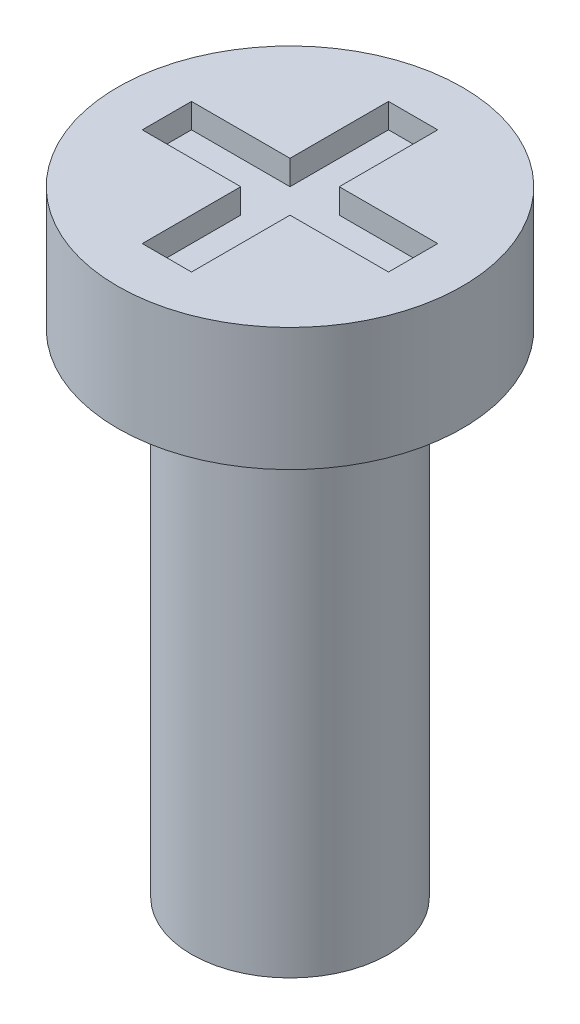
ISO-10303-21;
HEADER;
FILE_DESCRIPTION(('STEP AP214'),'2;1');
FILE_NAME('part.step','',(''),(''),'','','');
FILE_SCHEMA(('AUTOMOTIVE_DESIGN { 1 0 10303 214 1 1 1 1 }'));
ENDSEC;
DATA;
#1=APPLICATION_CONTEXT('core data for automotive mechanical design processes');
#2=APPLICATION_PROTOCOL_DEFINITION('international standard','automotive_design',2000,#1);
#3=PRODUCT_CONTEXT('',#1,'mechanical');
#4=PRODUCT('Part','Part','',(#3));
#5=PRODUCT_RELATED_PRODUCT_CATEGORY('part','',(#4));
#6=PRODUCT_DEFINITION_FORMATION('','',#4);
#7=PRODUCT_DEFINITION_CONTEXT('part definition',#1,'design');
#8=PRODUCT_DEFINITION('design','',#6,#7);
#9=PRODUCT_DEFINITION_SHAPE('','',#8);
#10=(LENGTH_UNIT() NAMED_UNIT(*) SI_UNIT(.MILLI.,.METRE.));
#11=(NAMED_UNIT(*) PLANE_ANGLE_UNIT() SI_UNIT($,.RADIAN.));
#12=(NAMED_UNIT(*) SI_UNIT($,.STERADIAN.) SOLID_ANGLE_UNIT());
#13=UNCERTAINTY_MEASURE_WITH_UNIT(LENGTH_MEASURE(1.E-05),#10,'distance_accuracy_value','');
#14=(GEOMETRIC_REPRESENTATION_CONTEXT(3) GLOBAL_UNCERTAINTY_ASSIGNED_CONTEXT((#13)) GLOBAL_UNIT_ASSIGNED_CONTEXT((#10,
#11,#12)) REPRESENTATION_CONTEXT('',''));
#15=CARTESIAN_POINT('',(0.,0.,0.));
#16=DIRECTION('',(0.,0.,1.));
#17=DIRECTION('',(1.,0.,0.));
#18=AXIS2_PLACEMENT_3D('',#15,#16,#17);
#19=CARTESIAN_POINT('',(0.,2.,0.));
#20=DIRECTION('',(0.,-1.,0.));
#21=DIRECTION('',(0.,0.,-1.));
#22=AXIS2_PLACEMENT_3D('',#19,#20,#21);
#23=CYLINDRICAL_SURFACE('',#22,0.399999999999999);
#24=CARTESIAN_POINT('',(0.,2.,0.));
#25=DIRECTION('',(0.,1.,0.));
#26=DIRECTION('',(0.,0.,1.));
#27=AXIS2_PLACEMENT_3D('',#24,#25,#26);
#28=CIRCLE('',#27,0.399999999999999);
#29=CARTESIAN_POINT('',(0.,2.,0.399999999999999));
#30=VERTEX_POINT('',#29);
#31=EDGE_CURVE('E11',#30,#30,#28,.T.);
#32=ORIENTED_EDGE('',*,*,#31,.F.);
#33=EDGE_LOOP('',(#32));
#34=FACE_BOUND('',#33,.T.);
#35=CARTESIAN_POINT('',(0.,0.,0.));
#36=DIRECTION('',(0.,1.,0.));
#37=DIRECTION('',(0.,0.,1.));
#38=AXIS2_PLACEMENT_3D('',#35,#36,#37);
#39=CIRCLE('',#38,0.399999999999999);
#40=CARTESIAN_POINT('',(0.,0.,0.399999999999999));
#41=VERTEX_POINT('',#40);
#42=EDGE_CURVE('E36',#41,#41,#39,.T.);
#43=ORIENTED_EDGE('',*,*,#42,.T.);
#44=EDGE_LOOP('',(#43));
#45=FACE_BOUND('',#44,.T.);
#46=ADVANCED_FACE('F33',(#34,#45),#23,.T.);
#47=CARTESIAN_POINT('',(0.,0.,0.));
#48=DIRECTION('',(0.,1.,0.));
#49=DIRECTION('',(0.,0.,1.));
#50=AXIS2_PLACEMENT_3D('',#47,#48,#49);
#51=PLANE('',#50);
#52=ORIENTED_EDGE('',*,*,#42,.F.);
#53=EDGE_LOOP('',(#52));
#54=FACE_BOUND('',#53,.T.);
#55=ADVANCED_FACE('F230',(#54),#51,.F.);
#56=CARTESIAN_POINT('',(0.,2.5,0.));
#57=DIRECTION('',(0.,-1.,0.));
#58=DIRECTION('',(0.,0.,-1.));
#59=AXIS2_PLACEMENT_3D('',#56,#57,#58);
#60=CYLINDRICAL_SURFACE('',#59,0.7);
#61=CARTESIAN_POINT('',(0.,2.5,0.));
#62=DIRECTION('',(0.,1.,0.));
#63=DIRECTION('',(0.,0.,1.));
#64=AXIS2_PLACEMENT_3D('',#61,#62,#63);
#65=CIRCLE('',#64,0.7);
#66=CARTESIAN_POINT('',(0.,2.5,0.7));
#67=VERTEX_POINT('',#66);
#68=EDGE_CURVE('E206',#67,#67,#65,.T.);
#69=ORIENTED_EDGE('',*,*,#68,.F.);
#70=EDGE_LOOP('',(#69));
#71=FACE_BOUND('',#70,.T.);
#72=CARTESIAN_POINT('',(0.,2.,0.));
#73=DIRECTION('',(0.,1.,0.));
#74=DIRECTION('',(0.,0.,1.));
#75=AXIS2_PLACEMENT_3D('',#72,#73,#74);
#76=CIRCLE('',#75,0.7);
#77=CARTESIAN_POINT('',(0.,2.,0.7));
#78=VERTEX_POINT('',#77);
#79=EDGE_CURVE('E188',#78,#78,#76,.T.);
#80=ORIENTED_EDGE('',*,*,#79,.T.);
#81=EDGE_LOOP('',(#80));
#82=FACE_BOUND('',#81,.T.);
#83=ADVANCED_FACE('F212',(#71,#82),#60,.T.);
#84=CARTESIAN_POINT('',(0.,2.5,0.));
#85=DIRECTION('',(0.,1.,0.));
#86=DIRECTION('',(0.,0.,1.));
#87=AXIS2_PLACEMENT_3D('',#84,#85,#86);
#88=PLANE('',#87);
#89=DIRECTION('',(0.,0.,1.));
#90=VECTOR('',#89,1.);
#91=CARTESIAN_POINT('',(-0.5,2.5,-0.1));
#92=LINE('',#91,#90);
#93=CARTESIAN_POINT('',(-0.5,2.5,-0.1));
#94=VERTEX_POINT('',#93);
#95=CARTESIAN_POINT('',(-0.5,2.5,0.1));
#96=VERTEX_POINT('',#95);
#97=EDGE_CURVE('E47',#94,#96,#92,.T.);
#98=ORIENTED_EDGE('',*,*,#97,.F.);
#99=DIRECTION('',(-1.,0.,0.));
#100=VECTOR('',#99,1.);
#101=CARTESIAN_POINT('',(-0.5,2.5,-0.1));
#102=LINE('',#101,#100);
#103=CARTESIAN_POINT('',(-0.1,2.5,-0.1));
#104=VERTEX_POINT('',#103);
#105=EDGE_CURVE('E184',#104,#94,#102,.T.);
#106=ORIENTED_EDGE('',*,*,#105,.F.);
#107=DIRECTION('',(0.,0.,1.));
#108=VECTOR('',#107,1.);
#109=CARTESIAN_POINT('',(-0.1,2.5,-0.5));
#110=LINE('',#109,#108);
#111=CARTESIAN_POINT('',(-0.1,2.5,-0.5));
#112=VERTEX_POINT('',#111);
#113=EDGE_CURVE('E182',#112,#104,#110,.T.);
#114=ORIENTED_EDGE('',*,*,#113,.F.);
#115=DIRECTION('',(-1.,0.,0.));
#116=VECTOR('',#115,1.);
#117=CARTESIAN_POINT('',(-0.1,2.5,-0.5));
#118=LINE('',#117,#116);
#119=CARTESIAN_POINT('',(0.0999999999999999,2.5,-0.5));
#120=VERTEX_POINT('',#119);
#121=EDGE_CURVE('E131',#120,#112,#118,.T.);
#122=ORIENTED_EDGE('',*,*,#121,.F.);
#123=DIRECTION('',(0.,0.,-1.));
#124=VECTOR('',#123,1.);
#125=CARTESIAN_POINT('',(0.0999999999999999,2.5,-0.5));
#126=LINE('',#125,#124);
#127=CARTESIAN_POINT('',(0.1,2.5,-0.1));
#128=VERTEX_POINT('',#127);
#129=EDGE_CURVE('E178',#128,#120,#126,.T.);
#130=ORIENTED_EDGE('',*,*,#129,.F.);
#131=DIRECTION('',(-1.,0.,0.));
#132=VECTOR('',#131,1.);
#133=CARTESIAN_POINT('',(0.1,2.5,-0.1));
#134=LINE('',#133,#132);
#135=CARTESIAN_POINT('',(0.5,2.5,-0.1));
#136=VERTEX_POINT('',#135);
#137=EDGE_CURVE('E175',#136,#128,#134,.T.);
#138=ORIENTED_EDGE('',*,*,#137,.F.);
#139=DIRECTION('',(0.,0.,-1.));
#140=VECTOR('',#139,1.);
#141=CARTESIAN_POINT('',(0.5,2.5,-0.1));
#142=LINE('',#141,#140);
#143=CARTESIAN_POINT('',(0.5,2.5,0.1));
#144=VERTEX_POINT('',#143);
#145=EDGE_CURVE('E172',#144,#136,#142,.T.);
#146=ORIENTED_EDGE('',*,*,#145,.F.);
#147=DIRECTION('',(1.,0.,0.));
#148=VECTOR('',#147,1.);
#149=CARTESIAN_POINT('',(0.1,2.5,0.1));
#150=LINE('',#149,#148);
#151=CARTESIAN_POINT('',(0.1,2.5,0.1));
#152=VERTEX_POINT('',#151);
#153=EDGE_CURVE('E169',#152,#144,#150,.T.);
#154=ORIENTED_EDGE('',*,*,#153,.F.);
#155=DIRECTION('',(0.,0.,-1.));
#156=VECTOR('',#155,1.);
#157=CARTESIAN_POINT('',(0.1,2.5,0.1));
#158=LINE('',#157,#156);
#159=CARTESIAN_POINT('',(0.1,2.5,0.5));
#160=VERTEX_POINT('',#159);
#161=EDGE_CURVE('E166',#160,#152,#158,.T.);
#162=ORIENTED_EDGE('',*,*,#161,.F.);
#163=DIRECTION('',(1.,0.,0.));
#164=VECTOR('',#163,1.);
#165=CARTESIAN_POINT('',(-0.1,2.5,0.5));
#166=LINE('',#165,#164);
#167=CARTESIAN_POINT('',(-0.1,2.5,0.5));
#168=VERTEX_POINT('',#167);
#169=EDGE_CURVE('E163',#168,#160,#166,.T.);
#170=ORIENTED_EDGE('',*,*,#169,.F.);
#171=DIRECTION('',(0.,0.,1.));
#172=VECTOR('',#171,1.);
#173=CARTESIAN_POINT('',(-0.1,2.5,0.1));
#174=LINE('',#173,#172);
#175=CARTESIAN_POINT('',(-0.1,2.5,0.1));
#176=VERTEX_POINT('',#175);
#177=EDGE_CURVE('E160',#176,#168,#174,.T.);
#178=ORIENTED_EDGE('',*,*,#177,.F.);
#179=DIRECTION('',(1.,0.,0.));
#180=VECTOR('',#179,1.);
#181=CARTESIAN_POINT('',(-0.5,2.5,0.1));
#182=LINE('',#181,#180);
#183=EDGE_CURVE('E157',#96,#176,#182,.T.);
#184=ORIENTED_EDGE('',*,*,#183,.F.);
#185=EDGE_LOOP('',(#98,#106,#114,#122,#130,#138,#146,#154,#162,#170,#178,#184));
#186=FACE_BOUND('',#185,.T.);
#187=ORIENTED_EDGE('',*,*,#68,.T.);
#188=EDGE_LOOP('',(#187));
#189=FACE_BOUND('',#188,.T.);
#190=ADVANCED_FACE('F217',(#186,#189),#88,.T.);
#191=CARTESIAN_POINT('',(0.,2.,0.));
#192=DIRECTION('',(0.,1.,0.));
#193=DIRECTION('',(0.,0.,1.));
#194=AXIS2_PLACEMENT_3D('',#191,#192,#193);
#195=PLANE('',#194);
#196=ORIENTED_EDGE('',*,*,#31,.T.);
#197=EDGE_LOOP('',(#196));
#198=FACE_BOUND('',#197,.T.);
#199=ORIENTED_EDGE('',*,*,#79,.F.);
#200=EDGE_LOOP('',(#199));
#201=FACE_BOUND('',#200,.T.);
#202=ADVANCED_FACE('F214',(#198,#201),#195,.F.);
#203=CARTESIAN_POINT('',(-0.5,2.4,-0.1));
#204=DIRECTION('',(-1.,0.,0.));
#205=DIRECTION('',(0.,0.,1.));
#206=AXIS2_PLACEMENT_3D('',#203,#204,#205);
#207=PLANE('',#206);
#208=ORIENTED_EDGE('',*,*,#97,.T.);
#209=DIRECTION('',(0.,1.,0.));
#210=VECTOR('',#209,1.);
#211=CARTESIAN_POINT('',(-0.5,2.4,0.1));
#212=LINE('',#211,#210);
#213=CARTESIAN_POINT('',(-0.5,2.4,0.1));
#214=VERTEX_POINT('',#213);
#215=EDGE_CURVE('E95',#214,#96,#212,.T.);
#216=ORIENTED_EDGE('',*,*,#215,.F.);
#217=DIRECTION('',(0.,0.,1.));
#218=VECTOR('',#217,1.);
#219=CARTESIAN_POINT('',(-0.5,2.4,-0.1));
#220=LINE('',#219,#218);
#221=CARTESIAN_POINT('',(-0.5,2.4,-0.1));
#222=VERTEX_POINT('',#221);
#223=EDGE_CURVE('E186',#222,#214,#220,.T.);
#224=ORIENTED_EDGE('',*,*,#223,.F.);
#225=DIRECTION('',(0.,1.,0.));
#226=VECTOR('',#225,1.);
#227=CARTESIAN_POINT('',(-0.5,2.4,-0.1));
#228=LINE('',#227,#226);
#229=EDGE_CURVE('E55',#222,#94,#228,.T.);
#230=ORIENTED_EDGE('',*,*,#229,.T.);
#231=EDGE_LOOP('',(#208,#216,#224,#230));
#232=FACE_BOUND('',#231,.T.);
#233=ADVANCED_FACE('F216',(#232),#207,.F.);
#234=CARTESIAN_POINT('',(-0.5,2.4,-0.1));
#235=DIRECTION('',(0.,0.,-1.));
#236=DIRECTION('',(-1.,0.,0.));
#237=AXIS2_PLACEMENT_3D('',#234,#235,#236);
#238=PLANE('',#237);
#239=ORIENTED_EDGE('',*,*,#105,.T.);
#240=ORIENTED_EDGE('',*,*,#229,.F.);
#241=DIRECTION('',(-1.,0.,0.));
#242=VECTOR('',#241,1.);
#243=CARTESIAN_POINT('',(-0.5,2.4,-0.1));
#244=LINE('',#243,#242);
#245=CARTESIAN_POINT('',(-0.1,2.4,-0.1));
#246=VERTEX_POINT('',#245);
#247=EDGE_CURVE('E143',#246,#222,#244,.T.);
#248=ORIENTED_EDGE('',*,*,#247,.F.);
#249=DIRECTION('',(0.,1.,0.));
#250=VECTOR('',#249,1.);
#251=CARTESIAN_POINT('',(-0.1,2.4,-0.1));
#252=LINE('',#251,#250);
#253=EDGE_CURVE('E135',#246,#104,#252,.T.);
#254=ORIENTED_EDGE('',*,*,#253,.T.);
#255=EDGE_LOOP('',(#239,#240,#248,#254));
#256=FACE_BOUND('',#255,.T.);
#257=ADVANCED_FACE('F224',(#256),#238,.F.);
#258=CARTESIAN_POINT('',(-0.1,2.4,-0.5));
#259=DIRECTION('',(-1.,0.,0.));
#260=DIRECTION('',(0.,0.,1.));
#261=AXIS2_PLACEMENT_3D('',#258,#259,#260);
#262=PLANE('',#261);
#263=ORIENTED_EDGE('',*,*,#113,.T.);
#264=ORIENTED_EDGE('',*,*,#253,.F.);
#265=DIRECTION('',(0.,0.,1.));
#266=VECTOR('',#265,1.);
#267=CARTESIAN_POINT('',(-0.1,2.4,-0.5));
#268=LINE('',#267,#266);
#269=CARTESIAN_POINT('',(-0.1,2.4,-0.5));
#270=VERTEX_POINT('',#269);
#271=EDGE_CURVE('E139',#270,#246,#268,.T.);
#272=ORIENTED_EDGE('',*,*,#271,.F.);
#273=DIRECTION('',(0.,1.,0.));
#274=VECTOR('',#273,1.);
#275=CARTESIAN_POINT('',(-0.1,2.4,-0.5));
#276=LINE('',#275,#274);
#277=EDGE_CURVE('E124',#270,#112,#276,.T.);
#278=ORIENTED_EDGE('',*,*,#277,.T.);
#279=EDGE_LOOP('',(#263,#264,#272,#278));
#280=FACE_BOUND('',#279,.T.);
#281=ADVANCED_FACE('F140',(#280),#262,.F.);
#282=CARTESIAN_POINT('',(-0.1,2.4,-0.5));
#283=DIRECTION('',(0.,0.,-1.));
#284=DIRECTION('',(-1.,0.,0.));
#285=AXIS2_PLACEMENT_3D('',#282,#283,#284);
#286=PLANE('',#285);
#287=ORIENTED_EDGE('',*,*,#121,.T.);
#288=ORIENTED_EDGE('',*,*,#277,.F.);
#289=DIRECTION('',(-1.,0.,0.));
#290=VECTOR('',#289,1.);
#291=CARTESIAN_POINT('',(-0.1,2.4,-0.5));
#292=LINE('',#291,#290);
#293=CARTESIAN_POINT('',(0.0999999999999999,2.4,-0.5));
#294=VERTEX_POINT('',#293);
#295=EDGE_CURVE('E128',#294,#270,#292,.T.);
#296=ORIENTED_EDGE('',*,*,#295,.F.);
#297=DIRECTION('',(0.,1.,0.));
#298=VECTOR('',#297,1.);
#299=CARTESIAN_POINT('',(0.0999999999999999,2.4,-0.5));
#300=LINE('',#299,#298);
#301=EDGE_CURVE('E136',#294,#120,#300,.T.);
#302=ORIENTED_EDGE('',*,*,#301,.T.);
#303=EDGE_LOOP('',(#287,#288,#296,#302));
#304=FACE_BOUND('',#303,.T.);
#305=ADVANCED_FACE('F126',(#304),#286,.F.);
#306=CARTESIAN_POINT('',(0.0999999999999999,2.4,-0.5));
#307=DIRECTION('',(1.,0.,0.));
#308=DIRECTION('',(0.,0.,-1.));
#309=AXIS2_PLACEMENT_3D('',#306,#307,#308);
#310=PLANE('',#309);
#311=ORIENTED_EDGE('',*,*,#129,.T.);
#312=ORIENTED_EDGE('',*,*,#301,.F.);
#313=DIRECTION('',(0.,0.,-1.));
#314=VECTOR('',#313,1.);
#315=CARTESIAN_POINT('',(0.0999999999999999,2.4,-0.5));
#316=LINE('',#315,#314);
#317=CARTESIAN_POINT('',(0.1,2.4,-0.1));
#318=VERTEX_POINT('',#317);
#319=EDGE_CURVE('E149',#318,#294,#316,.T.);
#320=ORIENTED_EDGE('',*,*,#319,.F.);
#321=DIRECTION('',(0.,1.,0.));
#322=VECTOR('',#321,1.);
#323=CARTESIAN_POINT('',(0.1,2.4,-0.1));
#324=LINE('',#323,#322);
#325=EDGE_CURVE('E191',#318,#128,#324,.T.);
#326=ORIENTED_EDGE('',*,*,#325,.T.);
#327=EDGE_LOOP('',(#311,#312,#320,#326));
#328=FACE_BOUND('',#327,.T.);
#329=ADVANCED_FACE('F285',(#328),#310,.F.);
#330=CARTESIAN_POINT('',(0.1,2.4,-0.1));
#331=DIRECTION('',(0.,0.,-1.));
#332=DIRECTION('',(-1.,0.,0.));
#333=AXIS2_PLACEMENT_3D('',#330,#331,#332);
#334=PLANE('',#333);
#335=ORIENTED_EDGE('',*,*,#137,.T.);
#336=ORIENTED_EDGE('',*,*,#325,.F.);
#337=DIRECTION('',(-1.,0.,0.));
#338=VECTOR('',#337,1.);
#339=CARTESIAN_POINT('',(0.1,2.4,-0.1));
#340=LINE('',#339,#338);
#341=CARTESIAN_POINT('',(0.5,2.4,-0.1));
#342=VERTEX_POINT('',#341);
#343=EDGE_CURVE('E151',#342,#318,#340,.T.);
#344=ORIENTED_EDGE('',*,*,#343,.F.);
#345=DIRECTION('',(0.,1.,0.));
#346=VECTOR('',#345,1.);
#347=CARTESIAN_POINT('',(0.5,2.4,-0.1));
#348=LINE('',#347,#346);
#349=EDGE_CURVE('E193',#342,#136,#348,.T.);
#350=ORIENTED_EDGE('',*,*,#349,.T.);
#351=EDGE_LOOP('',(#335,#336,#344,#350));
#352=FACE_BOUND('',#351,.T.);
#353=ADVANCED_FACE('F294',(#352),#334,.F.);
#354=CARTESIAN_POINT('',(0.5,2.4,-0.1));
#355=DIRECTION('',(1.,0.,0.));
#356=DIRECTION('',(0.,0.,-1.));
#357=AXIS2_PLACEMENT_3D('',#354,#355,#356);
#358=PLANE('',#357);
#359=ORIENTED_EDGE('',*,*,#145,.T.);
#360=ORIENTED_EDGE('',*,*,#349,.F.);
#361=DIRECTION('',(0.,0.,-1.));
#362=VECTOR('',#361,1.);
#363=CARTESIAN_POINT('',(0.5,2.4,-0.1));
#364=LINE('',#363,#362);
#365=CARTESIAN_POINT('',(0.5,2.4,0.1));
#366=VERTEX_POINT('',#365);
#367=EDGE_CURVE('E399',#366,#342,#364,.T.);
#368=ORIENTED_EDGE('',*,*,#367,.F.);
#369=DIRECTION('',(0.,1.,0.));
#370=VECTOR('',#369,1.);
#371=CARTESIAN_POINT('',(0.5,2.4,0.1));
#372=LINE('',#371,#370);
#373=EDGE_CURVE('E195',#366,#144,#372,.T.);
#374=ORIENTED_EDGE('',*,*,#373,.T.);
#375=EDGE_LOOP('',(#359,#360,#368,#374));
#376=FACE_BOUND('',#375,.T.);
#377=ADVANCED_FACE('F304',(#376),#358,.F.);
#378=CARTESIAN_POINT('',(0.1,2.4,0.1));
#379=DIRECTION('',(0.,0.,1.));
#380=DIRECTION('',(1.,0.,0.));
#381=AXIS2_PLACEMENT_3D('',#378,#379,#380);
#382=PLANE('',#381);
#383=ORIENTED_EDGE('',*,*,#153,.T.);
#384=ORIENTED_EDGE('',*,*,#373,.F.);
#385=DIRECTION('',(1.,0.,0.));
#386=VECTOR('',#385,1.);
#387=CARTESIAN_POINT('',(0.1,2.4,0.1));
#388=LINE('',#387,#386);
#389=CARTESIAN_POINT('',(0.1,2.4,0.1));
#390=VERTEX_POINT('',#389);
#391=EDGE_CURVE('E396',#390,#366,#388,.T.);
#392=ORIENTED_EDGE('',*,*,#391,.F.);
#393=DIRECTION('',(0.,1.,0.));
#394=VECTOR('',#393,1.);
#395=CARTESIAN_POINT('',(0.1,2.4,0.1));
#396=LINE('',#395,#394);
#397=EDGE_CURVE('E197',#390,#152,#396,.T.);
#398=ORIENTED_EDGE('',*,*,#397,.T.);
#399=EDGE_LOOP('',(#383,#384,#392,#398));
#400=FACE_BOUND('',#399,.T.);
#401=ADVANCED_FACE('F314',(#400),#382,.F.);
#402=CARTESIAN_POINT('',(0.1,2.4,0.1));
#403=DIRECTION('',(1.,0.,0.));
#404=DIRECTION('',(0.,0.,-1.));
#405=AXIS2_PLACEMENT_3D('',#402,#403,#404);
#406=PLANE('',#405);
#407=ORIENTED_EDGE('',*,*,#161,.T.);
#408=ORIENTED_EDGE('',*,*,#397,.F.);
#409=DIRECTION('',(0.,0.,-1.));
#410=VECTOR('',#409,1.);
#411=CARTESIAN_POINT('',(0.1,2.4,0.1));
#412=LINE('',#411,#410);
#413=CARTESIAN_POINT('',(0.1,2.4,0.5));
#414=VERTEX_POINT('',#413);
#415=EDGE_CURVE('E393',#414,#390,#412,.T.);
#416=ORIENTED_EDGE('',*,*,#415,.F.);
#417=DIRECTION('',(0.,1.,0.));
#418=VECTOR('',#417,1.);
#419=CARTESIAN_POINT('',(0.1,2.4,0.5));
#420=LINE('',#419,#418);
#421=EDGE_CURVE('E199',#414,#160,#420,.T.);
#422=ORIENTED_EDGE('',*,*,#421,.T.);
#423=EDGE_LOOP('',(#407,#408,#416,#422));
#424=FACE_BOUND('',#423,.T.);
#425=ADVANCED_FACE('F324',(#424),#406,.F.);
#426=CARTESIAN_POINT('',(-0.1,2.4,0.5));
#427=DIRECTION('',(0.,0.,1.));
#428=DIRECTION('',(1.,0.,0.));
#429=AXIS2_PLACEMENT_3D('',#426,#427,#428);
#430=PLANE('',#429);
#431=ORIENTED_EDGE('',*,*,#169,.T.);
#432=ORIENTED_EDGE('',*,*,#421,.F.);
#433=DIRECTION('',(1.,0.,0.));
#434=VECTOR('',#433,1.);
#435=CARTESIAN_POINT('',(-0.1,2.4,0.5));
#436=LINE('',#435,#434);
#437=CARTESIAN_POINT('',(-0.1,2.4,0.5));
#438=VERTEX_POINT('',#437);
#439=EDGE_CURVE('E386',#438,#414,#436,.T.);
#440=ORIENTED_EDGE('',*,*,#439,.F.);
#441=DIRECTION('',(0.,1.,0.));
#442=VECTOR('',#441,1.);
#443=CARTESIAN_POINT('',(-0.1,2.4,0.5));
#444=LINE('',#443,#442);
#445=EDGE_CURVE('E201',#438,#168,#444,.T.);
#446=ORIENTED_EDGE('',*,*,#445,.T.);
#447=EDGE_LOOP('',(#431,#432,#440,#446));
#448=FACE_BOUND('',#447,.T.);
#449=ADVANCED_FACE('F334',(#448),#430,.F.);
#450=CARTESIAN_POINT('',(-0.1,2.4,0.1));
#451=DIRECTION('',(-1.,0.,0.));
#452=DIRECTION('',(0.,0.,1.));
#453=AXIS2_PLACEMENT_3D('',#450,#451,#452);
#454=PLANE('',#453);
#455=ORIENTED_EDGE('',*,*,#177,.T.);
#456=ORIENTED_EDGE('',*,*,#445,.F.);
#457=DIRECTION('',(0.,0.,1.));
#458=VECTOR('',#457,1.);
#459=CARTESIAN_POINT('',(-0.1,2.4,0.1));
#460=LINE('',#459,#458);
#461=CARTESIAN_POINT('',(-0.1,2.4,0.1));
#462=VERTEX_POINT('',#461);
#463=EDGE_CURVE('E383',#462,#438,#460,.T.);
#464=ORIENTED_EDGE('',*,*,#463,.F.);
#465=DIRECTION('',(0.,1.,0.));
#466=VECTOR('',#465,1.);
#467=CARTESIAN_POINT('',(-0.1,2.4,0.1));
#468=LINE('',#467,#466);
#469=EDGE_CURVE('E203',#462,#176,#468,.T.);
#470=ORIENTED_EDGE('',*,*,#469,.T.);
#471=EDGE_LOOP('',(#455,#456,#464,#470));
#472=FACE_BOUND('',#471,.T.);
#473=ADVANCED_FACE('F344',(#472),#454,.F.);
#474=CARTESIAN_POINT('',(-0.5,2.4,0.1));
#475=DIRECTION('',(0.,0.,1.));
#476=DIRECTION('',(1.,0.,0.));
#477=AXIS2_PLACEMENT_3D('',#474,#475,#476);
#478=PLANE('',#477);
#479=ORIENTED_EDGE('',*,*,#183,.T.);
#480=ORIENTED_EDGE('',*,*,#469,.F.);
#481=DIRECTION('',(1.,0.,0.));
#482=VECTOR('',#481,1.);
#483=CARTESIAN_POINT('',(-0.5,2.4,0.1));
#484=LINE('',#483,#482);
#485=EDGE_CURVE('E387',#214,#462,#484,.T.);
#486=ORIENTED_EDGE('',*,*,#485,.F.);
#487=ORIENTED_EDGE('',*,*,#215,.T.);
#488=EDGE_LOOP('',(#479,#480,#486,#487));
#489=FACE_BOUND('',#488,.T.);
#490=ADVANCED_FACE('F354',(#489),#478,.F.);
#491=CARTESIAN_POINT('',(0.,2.4,0.));
#492=DIRECTION('',(0.,1.,0.));
#493=DIRECTION('',(0.,0.,1.));
#494=AXIS2_PLACEMENT_3D('',#491,#492,#493);
#495=PLANE('',#494);
#496=ORIENTED_EDGE('',*,*,#223,.T.);
#497=ORIENTED_EDGE('',*,*,#485,.T.);
#498=ORIENTED_EDGE('',*,*,#463,.T.);
#499=ORIENTED_EDGE('',*,*,#439,.T.);
#500=ORIENTED_EDGE('',*,*,#415,.T.);
#501=ORIENTED_EDGE('',*,*,#391,.T.);
#502=ORIENTED_EDGE('',*,*,#367,.T.);
#503=ORIENTED_EDGE('',*,*,#343,.T.);
#504=ORIENTED_EDGE('',*,*,#319,.T.);
#505=ORIENTED_EDGE('',*,*,#295,.T.);
#506=ORIENTED_EDGE('',*,*,#271,.T.);
#507=ORIENTED_EDGE('',*,*,#247,.T.);
#508=EDGE_LOOP('',(#496,#497,#498,#499,#500,#501,#502,#503,#504,#505,#506,#507));
#509=FACE_BOUND('',#508,.T.);
#510=ADVANCED_FACE('F146',(#509),#495,.T.);
#511=CLOSED_SHELL('',(#46,#55,#83,#190,#202,#233,#257,#281,#305,#329,#353,#377,#401,#425,#449,
#473,#490,#510));
#512=MANIFOLD_SOLID_BREP('B2',#511);
#513=ADVANCED_BREP_SHAPE_REPRESENTATION('',(#18,#512),#14);
#514=SHAPE_DEFINITION_REPRESENTATION(#9,#513);
ENDSEC;
END-ISO-10303-21;
